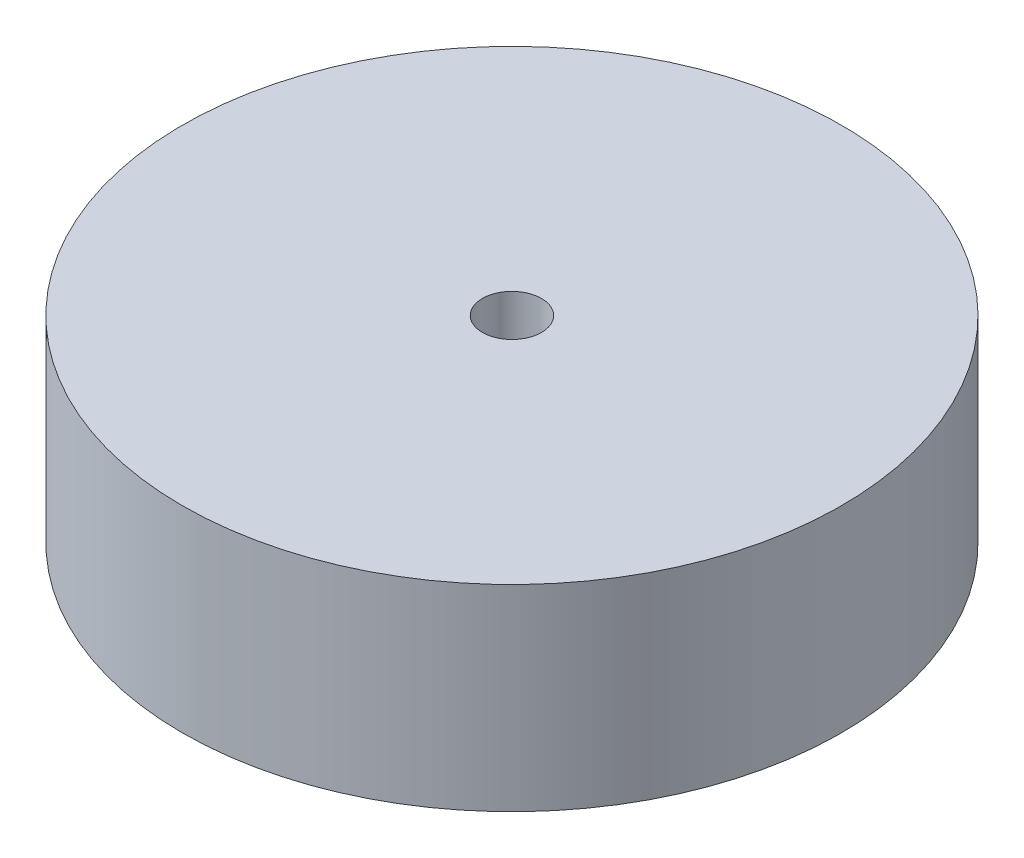
ISO-10303-21;
HEADER;
FILE_DESCRIPTION(('STEP AP214'),'2;1');
FILE_NAME('part.step','',(''),(''),'','','');
FILE_SCHEMA(('AUTOMOTIVE_DESIGN { 1 0 10303 214 1 1 1 1 }'));
ENDSEC;
DATA;
#1=APPLICATION_CONTEXT('core data for automotive mechanical design processes');
#2=APPLICATION_PROTOCOL_DEFINITION('international standard','automotive_design',2000,#1);
#3=PRODUCT_CONTEXT('',#1,'mechanical');
#4=PRODUCT('Part','Part','',(#3));
#5=PRODUCT_RELATED_PRODUCT_CATEGORY('part','',(#4));
#6=PRODUCT_DEFINITION_FORMATION('','',#4);
#7=PRODUCT_DEFINITION_CONTEXT('part definition',#1,'design');
#8=PRODUCT_DEFINITION('design','',#6,#7);
#9=PRODUCT_DEFINITION_SHAPE('','',#8);
#10=(LENGTH_UNIT() NAMED_UNIT(*) SI_UNIT(.MILLI.,.METRE.));
#11=(NAMED_UNIT(*) PLANE_ANGLE_UNIT() SI_UNIT($,.RADIAN.));
#12=(NAMED_UNIT(*) SI_UNIT($,.STERADIAN.) SOLID_ANGLE_UNIT());
#13=UNCERTAINTY_MEASURE_WITH_UNIT(LENGTH_MEASURE(1.E-05),#10,'distance_accuracy_value','');
#14=(GEOMETRIC_REPRESENTATION_CONTEXT(3) GLOBAL_UNCERTAINTY_ASSIGNED_CONTEXT((#13)) GLOBAL_UNIT_ASSIGNED_CONTEXT((#10,
#11,#12)) REPRESENTATION_CONTEXT('',''));
#15=CARTESIAN_POINT('',(0.,0.,0.));
#16=DIRECTION('',(0.,0.,1.));
#17=DIRECTION('',(1.,0.,0.));
#18=AXIS2_PLACEMENT_3D('',#15,#16,#17);
#19=CARTESIAN_POINT('',(0.,20.,0.));
#20=DIRECTION('',(0.,1.,0.));
#21=DIRECTION('',(0.,0.,1.));
#22=AXIS2_PLACEMENT_3D('',#19,#20,#21);
#23=PLANE('',#22);
#24=CARTESIAN_POINT('',(0.,20.,0.));
#25=DIRECTION('',(0.,1.,0.));
#26=DIRECTION('',(0.,0.,1.));
#27=AXIS2_PLACEMENT_3D('',#24,#25,#26);
#28=CIRCLE('',#27,33.5);
#29=CARTESIAN_POINT('',(0.,20.,33.5));
#30=VERTEX_POINT('',#29);
#31=EDGE_CURVE('E10',#30,#30,#28,.T.);
#32=ORIENTED_EDGE('',*,*,#31,.T.);
#33=EDGE_LOOP('',(#32));
#34=FACE_BOUND('',#33,.T.);
#35=CARTESIAN_POINT('',(0.,20.,0.));
#36=DIRECTION('',(0.,1.,0.));
#37=DIRECTION('',(0.,0.,1.));
#38=AXIS2_PLACEMENT_3D('',#35,#36,#37);
#39=CIRCLE('',#38,3.);
#40=CARTESIAN_POINT('',(0.,20.,3.));
#41=VERTEX_POINT('',#40);
#42=EDGE_CURVE('E54',#41,#41,#39,.T.);
#43=ORIENTED_EDGE('',*,*,#42,.F.);
#44=EDGE_LOOP('',(#43));
#45=FACE_BOUND('',#44,.T.);
#46=ADVANCED_FACE('F41',(#34,#45),#23,.T.);
#47=CARTESIAN_POINT('',(0.,0.,0.));
#48=DIRECTION('',(0.,1.,0.));
#49=DIRECTION('',(0.,0.,1.));
#50=AXIS2_PLACEMENT_3D('',#47,#48,#49);
#51=PLANE('',#50);
#52=CARTESIAN_POINT('',(0.,0.,0.));
#53=DIRECTION('',(0.,1.,0.));
#54=DIRECTION('',(0.,0.,1.));
#55=AXIS2_PLACEMENT_3D('',#52,#53,#54);
#56=CIRCLE('',#55,33.5);
#57=CARTESIAN_POINT('',(0.,0.,33.5));
#58=VERTEX_POINT('',#57);
#59=EDGE_CURVE('E45',#58,#58,#56,.T.);
#60=ORIENTED_EDGE('',*,*,#59,.F.);
#61=EDGE_LOOP('',(#60));
#62=FACE_BOUND('',#61,.T.);
#63=CARTESIAN_POINT('',(0.,0.,0.));
#64=DIRECTION('',(0.,1.,0.));
#65=DIRECTION('',(0.,0.,1.));
#66=AXIS2_PLACEMENT_3D('',#63,#64,#65);
#67=CIRCLE('',#66,3.);
#68=CARTESIAN_POINT('',(0.,0.,3.));
#69=VERTEX_POINT('',#68);
#70=EDGE_CURVE('E56',#69,#69,#67,.T.);
#71=ORIENTED_EDGE('',*,*,#70,.T.);
#72=EDGE_LOOP('',(#71));
#73=FACE_BOUND('',#72,.T.);
#74=ADVANCED_FACE('F68',(#62,#73),#51,.F.);
#75=CARTESIAN_POINT('',(0.,20.,0.));
#76=DIRECTION('',(0.,-1.,0.));
#77=DIRECTION('',(0.,0.,-1.));
#78=AXIS2_PLACEMENT_3D('',#75,#76,#77);
#79=CYLINDRICAL_SURFACE('',#78,33.5);
#80=ORIENTED_EDGE('',*,*,#31,.F.);
#81=EDGE_LOOP('',(#80));
#82=FACE_BOUND('',#81,.T.);
#83=ORIENTED_EDGE('',*,*,#59,.T.);
#84=EDGE_LOOP('',(#83));
#85=FACE_BOUND('',#84,.T.);
#86=ADVANCED_FACE('F43',(#82,#85),#79,.T.);
#87=CARTESIAN_POINT('',(0.,20.,0.));
#88=DIRECTION('',(0.,-1.,0.));
#89=DIRECTION('',(0.,0.,-1.));
#90=AXIS2_PLACEMENT_3D('',#87,#88,#89);
#91=CYLINDRICAL_SURFACE('',#90,3.);
#92=ORIENTED_EDGE('',*,*,#42,.T.);
#93=EDGE_LOOP('',(#92));
#94=FACE_BOUND('',#93,.T.);
#95=ORIENTED_EDGE('',*,*,#70,.F.);
#96=EDGE_LOOP('',(#95));
#97=FACE_BOUND('',#96,.T.);
#98=ADVANCED_FACE('F64',(#94,#97),#91,.F.);
#99=CLOSED_SHELL('',(#46,#74,#86,#98));
#100=MANIFOLD_SOLID_BREP('B2',#99);
#101=ADVANCED_BREP_SHAPE_REPRESENTATION('',(#18,#100),#14);
#102=SHAPE_DEFINITION_REPRESENTATION(#9,#101);
ENDSEC;
END-ISO-10303-21;
